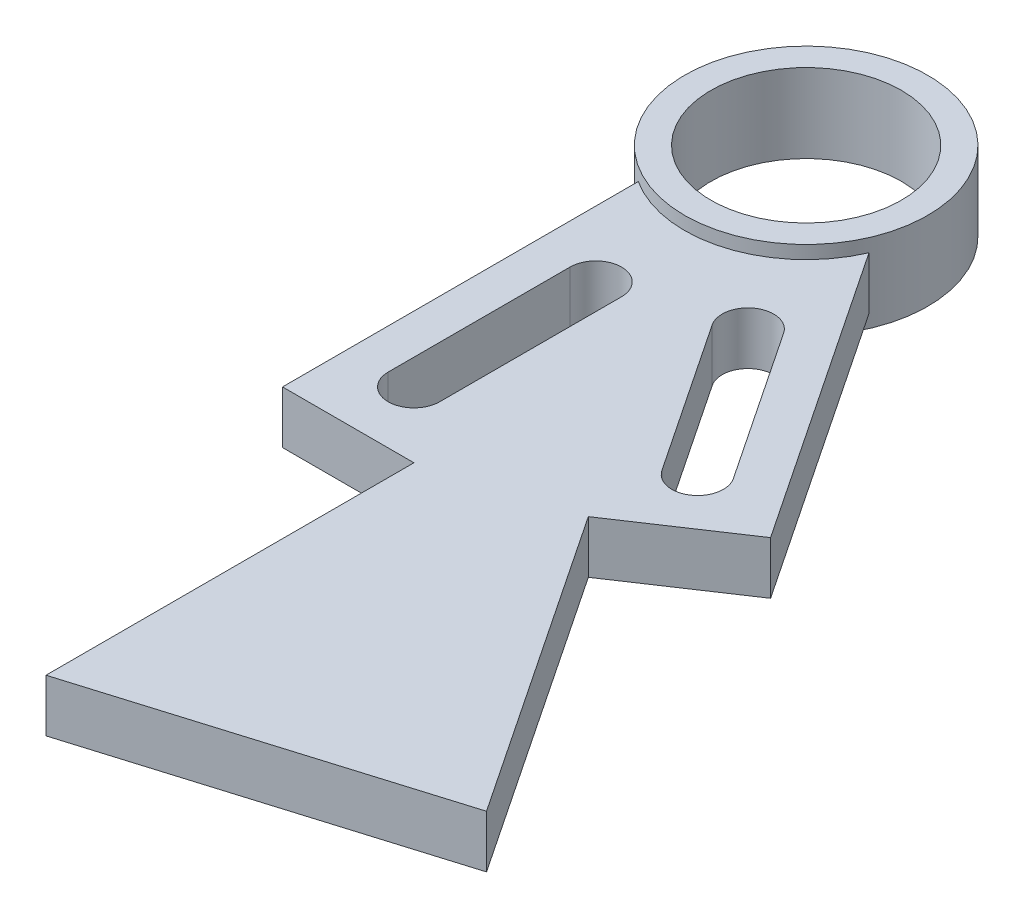
ISO-10303-21;
HEADER;
FILE_DESCRIPTION(('STEP AP214'),'2;1');
FILE_NAME('part.step','',(''),(''),'','','');
FILE_SCHEMA(('AUTOMOTIVE_DESIGN { 1 0 10303 214 1 1 1 1 }'));
ENDSEC;
DATA;
#1=APPLICATION_CONTEXT('core data for automotive mechanical design processes');
#2=APPLICATION_PROTOCOL_DEFINITION('international standard','automotive_design',2000,#1);
#3=PRODUCT_CONTEXT('',#1,'mechanical');
#4=PRODUCT('Part','Part','',(#3));
#5=PRODUCT_RELATED_PRODUCT_CATEGORY('part','',(#4));
#6=PRODUCT_DEFINITION_FORMATION('','',#4);
#7=PRODUCT_DEFINITION_CONTEXT('part definition',#1,'design');
#8=PRODUCT_DEFINITION('design','',#6,#7);
#9=PRODUCT_DEFINITION_SHAPE('','',#8);
#10=(LENGTH_UNIT() NAMED_UNIT(*) SI_UNIT(.MILLI.,.METRE.));
#11=(NAMED_UNIT(*) PLANE_ANGLE_UNIT() SI_UNIT($,.RADIAN.));
#12=(NAMED_UNIT(*) SI_UNIT($,.STERADIAN.) SOLID_ANGLE_UNIT());
#13=UNCERTAINTY_MEASURE_WITH_UNIT(LENGTH_MEASURE(1.E-05),#10,'distance_accuracy_value','');
#14=(GEOMETRIC_REPRESENTATION_CONTEXT(3) GLOBAL_UNCERTAINTY_ASSIGNED_CONTEXT((#13)) GLOBAL_UNIT_ASSIGNED_CONTEXT((#10,
#11,#12)) REPRESENTATION_CONTEXT('',''));
#15=CARTESIAN_POINT('',(0.,0.,0.));
#16=DIRECTION('',(0.,0.,1.));
#17=DIRECTION('',(1.,0.,0.));
#18=AXIS2_PLACEMENT_3D('',#15,#16,#17);
#19=CARTESIAN_POINT('',(0.,4.7625,0.));
#20=DIRECTION('',(0.,-1.,0.));
#21=DIRECTION('',(0.,0.,-1.));
#22=AXIS2_PLACEMENT_3D('',#19,#20,#21);
#23=CYLINDRICAL_SURFACE('',#22,11.5062);
#24=CARTESIAN_POINT('',(0.,4.7625,0.));
#25=DIRECTION('',(0.,1.,0.));
#26=DIRECTION('',(0.,0.,1.));
#27=AXIS2_PLACEMENT_3D('',#24,#25,#26);
#28=CIRCLE('',#27,11.5062);
#29=CARTESIAN_POINT('',(0.,4.7625,-11.5062));
#30=VERTEX_POINT('',#29);
#31=EDGE_CURVE('E51',#30,#30,#28,.T.);
#32=CARTESIAN_POINT('',(0.,-4.7625,0.));
#33=DIRECTION('',(0.,1.,0.));
#34=DIRECTION('',(0.,0.,1.));
#35=AXIS2_PLACEMENT_3D('',#32,#33,#34);
#36=CIRCLE('',#35,11.5062);
#37=CARTESIAN_POINT('',(0.,-4.7625,-11.5062));
#38=VERTEX_POINT('',#37);
#39=EDGE_CURVE('E271',#38,#38,#36,.T.);
#40=CARTESIAN_POINT('',(0.,4.7625,-11.5062));
#41=CARTESIAN_POINT('',(0.,4.66328125,-11.5062));
#42=CARTESIAN_POINT('',(0.,4.5640625,-11.5062));
#43=CARTESIAN_POINT('',(0.,4.365625,-11.5062));
#44=CARTESIAN_POINT('',(0.,4.26640625,-11.5062));
#45=CARTESIAN_POINT('',(0.,4.06796875,-11.5062));
#46=CARTESIAN_POINT('',(0.,3.96875,-11.5062));
#47=CARTESIAN_POINT('',(0.,3.7703125,-11.5062));
#48=CARTESIAN_POINT('',(0.,3.67109375,-11.5062));
#49=CARTESIAN_POINT('',(0.,3.47265625,-11.5062));
#50=CARTESIAN_POINT('',(0.,3.3734375,-11.5062));
#51=CARTESIAN_POINT('',(0.,3.175,-11.5062));
#52=CARTESIAN_POINT('',(0.,3.07578125,-11.5062));
#53=CARTESIAN_POINT('',(0.,2.87734375,-11.5062));
#54=CARTESIAN_POINT('',(0.,2.778125,-11.5062));
#55=CARTESIAN_POINT('',(0.,2.5796875,-11.5062));
#56=CARTESIAN_POINT('',(0.,2.48046875,-11.5062));
#57=CARTESIAN_POINT('',(0.,2.28203125,-11.5062));
#58=CARTESIAN_POINT('',(0.,2.1828125,-11.5062));
#59=CARTESIAN_POINT('',(0.,1.984375,-11.5062));
#60=CARTESIAN_POINT('',(0.,1.88515625,-11.5062));
#61=CARTESIAN_POINT('',(0.,1.68671875,-11.5062));
#62=CARTESIAN_POINT('',(0.,1.5875,-11.5062));
#63=CARTESIAN_POINT('',(0.,1.3890625,-11.5062));
#64=CARTESIAN_POINT('',(0.,1.28984375,-11.5062));
#65=CARTESIAN_POINT('',(0.,1.09140625,-11.5062));
#66=CARTESIAN_POINT('',(0.,0.992187499999999,-11.5062));
#67=CARTESIAN_POINT('',(0.,0.79375,-11.5062));
#68=CARTESIAN_POINT('',(0.,0.69453125,-11.5062));
#69=CARTESIAN_POINT('',(0.,0.49609375,-11.5062));
#70=CARTESIAN_POINT('',(0.,0.396875,-11.5062));
#71=CARTESIAN_POINT('',(0.,0.1984375,-11.5062));
#72=CARTESIAN_POINT('',(0.,0.0992187500000001,-11.5062));
#73=CARTESIAN_POINT('',(0.,-0.0992187500000001,-11.5062));
#74=CARTESIAN_POINT('',(0.,-0.1984375,-11.5062));
#75=CARTESIAN_POINT('',(0.,-0.396875,-11.5062));
#76=CARTESIAN_POINT('',(0.,-0.49609375,-11.5062));
#77=CARTESIAN_POINT('',(0.,-0.69453125,-11.5062));
#78=CARTESIAN_POINT('',(0.,-0.793750000000001,-11.5062));
#79=CARTESIAN_POINT('',(0.,-0.992187500000001,-11.5062));
#80=CARTESIAN_POINT('',(0.,-1.09140625,-11.5062));
#81=CARTESIAN_POINT('',(0.,-1.28984375,-11.5062));
#82=CARTESIAN_POINT('',(0.,-1.3890625,-11.5062));
#83=CARTESIAN_POINT('',(0.,-1.5875,-11.5062));
#84=CARTESIAN_POINT('',(0.,-1.68671875,-11.5062));
#85=CARTESIAN_POINT('',(0.,-1.88515625,-11.5062));
#86=CARTESIAN_POINT('',(0.,-1.984375,-11.5062));
#87=CARTESIAN_POINT('',(0.,-2.1828125,-11.5062));
#88=CARTESIAN_POINT('',(0.,-2.28203125,-11.5062));
#89=CARTESIAN_POINT('',(0.,-2.48046875,-11.5062));
#90=CARTESIAN_POINT('',(0.,-2.5796875,-11.5062));
#91=CARTESIAN_POINT('',(0.,-2.778125,-11.5062));
#92=CARTESIAN_POINT('',(0.,-2.87734375,-11.5062));
#93=CARTESIAN_POINT('',(0.,-3.07578125,-11.5062));
#94=CARTESIAN_POINT('',(0.,-3.175,-11.5062));
#95=CARTESIAN_POINT('',(0.,-3.3734375,-11.5062));
#96=CARTESIAN_POINT('',(0.,-3.47265625,-11.5062));
#97=CARTESIAN_POINT('',(0.,-3.67109375,-11.5062));
#98=CARTESIAN_POINT('',(0.,-3.7703125,-11.5062));
#99=CARTESIAN_POINT('',(0.,-3.96875,-11.5062));
#100=CARTESIAN_POINT('',(0.,-4.06796875,-11.5062));
#101=CARTESIAN_POINT('',(0.,-4.26640625,-11.5062));
#102=CARTESIAN_POINT('',(0.,-4.365625,-11.5062));
#103=CARTESIAN_POINT('',(0.,-4.5640625,-11.5062));
#104=CARTESIAN_POINT('',(0.,-4.66328125,-11.5062));
#105=CARTESIAN_POINT('',(0.,-4.7625,-11.5062));
#106=B_SPLINE_CURVE_WITH_KNOTS('',3,(#40,#41,#42,#43,#44,#45,#46,#47,#48,#49,#50,#51,#52,#53,
#54,#55,#56,#57,#58,#59,#60,#61,#62,#63,#64,#65,#66,#67,#68,#69,#70,#71,#72,#73,#74,#75,#76,#77,
#78,#79,#80,#81,#82,#83,#84,#85,#86,#87,#88,#89,#90,#91,#92,#93,#94,#95,#96,#97,#98,#99,#100,
#101,#102,#103,#104,#105),.UNSPECIFIED.,.F.,.F.,(4,2,2,2,2,2,2,2,2,2,2,2,2,2,2,2,2,2,2,2,2,2,2,
2,2,2,2,2,2,2,2,2,4),(0.,0.29765625,0.5953125,0.892968750000001,1.190625,1.48828125,1.7859375,
2.08359375,2.38125,2.67890625,2.9765625,3.27421875,3.571875,3.86953125,4.1671875,4.46484375,
4.7625,5.06015625,5.3578125,5.65546875,5.953125,6.25078125,6.5484375,6.84609375,7.14375,
7.44140625,7.7390625,8.03671875,8.334375,8.63203125,8.9296875,9.22734375,9.525),.UNSPECIFIED.);
#107=EDGE_CURVE('BSEAM43',#30,#38,#106,.T.);
#108=ORIENTED_EDGE('',*,*,#31,.T.);
#109=ORIENTED_EDGE('',*,*,#39,.F.);
#110=ORIENTED_EDGE('',*,*,#107,.T.);
#111=ORIENTED_EDGE('',*,*,#107,.F.);
#112=EDGE_LOOP('',(#108,#110,#109,#111));
#113=FACE_BOUND('',#112,.T.);
#114=ADVANCED_FACE('F43',(#113),#23,.F.);
#115=CARTESIAN_POINT('',(0.,4.7625,0.));
#116=DIRECTION('',(0.,-1.,0.));
#117=DIRECTION('',(0.,0.,-1.));
#118=AXIS2_PLACEMENT_3D('',#115,#116,#117);
#119=CYLINDRICAL_SURFACE('',#118,14.6812);
#120=DIRECTION('',(0.,-1.,0.));
#121=VECTOR('',#120,1.);
#122=CARTESIAN_POINT('',(-7.93749999999998,3.175,12.3504545337409));
#123=LINE('',#122,#121);
#124=CARTESIAN_POINT('',(-7.93749999999998,3.175,12.3504545337409));
#125=VERTEX_POINT('',#124);
#126=CARTESIAN_POINT('',(-7.93749999999998,-3.175,12.3504545337409));
#127=VERTEX_POINT('',#126);
#128=EDGE_CURVE('E64',#125,#127,#123,.T.);
#129=ORIENTED_EDGE('',*,*,#128,.F.);
#130=CARTESIAN_POINT('',(0.,3.175,0.));
#131=DIRECTION('',(0.,1.,0.));
#132=DIRECTION('',(0.,0.,1.));
#133=AXIS2_PLACEMENT_3D('',#130,#131,#132);
#134=CIRCLE('',#133,14.6812);
#135=CARTESIAN_POINT('',(13.4579373358023,3.175,5.86698867440691));
#136=VERTEX_POINT('',#135);
#137=EDGE_CURVE('E59',#125,#136,#134,.T.);
#138=ORIENTED_EDGE('',*,*,#137,.T.);
#139=DIRECTION('',(0.,-1.,0.));
#140=VECTOR('',#139,1.);
#141=CARTESIAN_POINT('',(13.4579373358023,3.175,5.86698867440691));
#142=LINE('',#141,#140);
#143=CARTESIAN_POINT('',(13.4579373358023,-3.175,5.86698867440691));
#144=VERTEX_POINT('',#143);
#145=EDGE_CURVE('E282',#136,#144,#142,.T.);
#146=ORIENTED_EDGE('',*,*,#145,.T.);
#147=CARTESIAN_POINT('',(0.,-3.175,0.));
#148=DIRECTION('',(0.,1.,0.));
#149=DIRECTION('',(0.,0.,1.));
#150=AXIS2_PLACEMENT_3D('',#147,#148,#149);
#151=CIRCLE('',#150,14.6812);
#152=EDGE_CURVE('E236',#127,#144,#151,.T.);
#153=ORIENTED_EDGE('',*,*,#152,.F.);
#154=EDGE_LOOP('',(#129,#138,#146,#153));
#155=FACE_BOUND('',#154,.T.);
#156=CARTESIAN_POINT('',(0.,4.7625,0.));
#157=DIRECTION('',(0.,1.,0.));
#158=DIRECTION('',(0.,0.,1.));
#159=AXIS2_PLACEMENT_3D('',#156,#157,#158);
#160=CIRCLE('',#159,14.6812);
#161=CARTESIAN_POINT('',(0.,4.7625,14.6812));
#162=VERTEX_POINT('',#161);
#163=EDGE_CURVE('E11',#162,#162,#160,.T.);
#164=ORIENTED_EDGE('',*,*,#163,.F.);
#165=EDGE_LOOP('',(#164));
#166=FACE_BOUND('',#165,.T.);
#167=CARTESIAN_POINT('',(0.,-4.7625,0.));
#168=DIRECTION('',(0.,1.,0.));
#169=DIRECTION('',(0.,0.,1.));
#170=AXIS2_PLACEMENT_3D('',#167,#168,#169);
#171=CIRCLE('',#170,14.6812);
#172=CARTESIAN_POINT('',(0.,-4.7625,14.6812));
#173=VERTEX_POINT('',#172);
#174=EDGE_CURVE('E46',#173,#173,#171,.T.);
#175=ORIENTED_EDGE('',*,*,#174,.T.);
#176=EDGE_LOOP('',(#175));
#177=FACE_BOUND('',#176,.T.);
#178=ADVANCED_FACE('F299',(#155,#166,#177),#119,.T.);
#179=CARTESIAN_POINT('',(0.,4.7625,0.));
#180=DIRECTION('',(0.,1.,0.));
#181=DIRECTION('',(0.,0.,1.));
#182=AXIS2_PLACEMENT_3D('',#179,#180,#181);
#183=PLANE('',#182);
#184=ORIENTED_EDGE('',*,*,#31,.F.);
#185=EDGE_LOOP('',(#184));
#186=FACE_BOUND('',#185,.T.);
#187=ORIENTED_EDGE('',*,*,#163,.T.);
#188=EDGE_LOOP('',(#187));
#189=FACE_BOUND('',#188,.T.);
#190=ADVANCED_FACE('F304',(#186,#189),#183,.T.);
#191=CARTESIAN_POINT('',(0.,-4.7625,0.));
#192=DIRECTION('',(0.,1.,0.));
#193=DIRECTION('',(0.,0.,1.));
#194=AXIS2_PLACEMENT_3D('',#191,#192,#193);
#195=PLANE('',#194);
#196=ORIENTED_EDGE('',*,*,#39,.T.);
#197=EDGE_LOOP('',(#196));
#198=FACE_BOUND('',#197,.T.);
#199=ORIENTED_EDGE('',*,*,#174,.F.);
#200=EDGE_LOOP('',(#199));
#201=FACE_BOUND('',#200,.T.);
#202=ADVANCED_FACE('F301',(#198,#201),#195,.F.);
#203=CARTESIAN_POINT('',(0.,3.175,25.4127));
#204=DIRECTION('',(0.,-1.,0.));
#205=DIRECTION('',(0.,0.,-1.));
#206=AXIS2_PLACEMENT_3D('',#203,#204,#205);
#207=CYLINDRICAL_SURFACE('',#206,3.1115);
#208=CARTESIAN_POINT('',(0.,-3.175,25.4127));
#209=DIRECTION('',(0.,1.,0.));
#210=DIRECTION('',(0.,0.,1.));
#211=AXIS2_PLACEMENT_3D('',#208,#209,#210);
#212=CIRCLE('',#211,3.1115);
#213=CARTESIAN_POINT('',(3.1115,-3.175,25.4127));
#214=VERTEX_POINT('',#213);
#215=CARTESIAN_POINT('',(-3.11150000000001,-3.175,25.4127));
#216=VERTEX_POINT('',#215);
#217=EDGE_CURVE('E251',#214,#216,#212,.T.);
#218=ORIENTED_EDGE('',*,*,#217,.F.);
#219=DIRECTION('',(0.,-1.,0.));
#220=VECTOR('',#219,1.);
#221=CARTESIAN_POINT('',(3.1115,3.175,25.4127));
#222=LINE('',#221,#220);
#223=CARTESIAN_POINT('',(3.1115,3.175,25.4127));
#224=VERTEX_POINT('',#223);
#225=EDGE_CURVE('E269',#224,#214,#222,.T.);
#226=ORIENTED_EDGE('',*,*,#225,.F.);
#227=CARTESIAN_POINT('',(0.,3.175,25.4127));
#228=DIRECTION('',(0.,1.,0.));
#229=DIRECTION('',(0.,0.,1.));
#230=AXIS2_PLACEMENT_3D('',#227,#228,#229);
#231=CIRCLE('',#230,3.1115);
#232=CARTESIAN_POINT('',(-3.11150000000001,3.175,25.4127));
#233=VERTEX_POINT('',#232);
#234=EDGE_CURVE('E206',#224,#233,#231,.T.);
#235=ORIENTED_EDGE('',*,*,#234,.T.);
#236=DIRECTION('',(0.,-1.,0.));
#237=VECTOR('',#236,1.);
#238=CARTESIAN_POINT('',(-3.11150000000001,3.175,25.4127));
#239=LINE('',#238,#237);
#240=EDGE_CURVE('E262',#233,#216,#239,.T.);
#241=ORIENTED_EDGE('',*,*,#240,.T.);
#242=EDGE_LOOP('',(#218,#226,#235,#241));
#243=FACE_BOUND('',#242,.T.);
#244=ADVANCED_FACE('F303',(#243),#207,.F.);
#245=CARTESIAN_POINT('',(3.11149999999999,3.175,0.));
#246=DIRECTION('',(-1.,0.,0.));
#247=DIRECTION('',(0.,0.,1.));
#248=AXIS2_PLACEMENT_3D('',#245,#246,#247);
#249=PLANE('',#248);
#250=DIRECTION('',(0.,0.,-1.));
#251=VECTOR('',#250,1.);
#252=CARTESIAN_POINT('',(3.11149999999999,-3.175,0.));
#253=LINE('',#252,#251);
#254=CARTESIAN_POINT('',(3.1115,-3.175,47.3837));
#255=VERTEX_POINT('',#254);
#256=EDGE_CURVE('E254',#255,#214,#253,.T.);
#257=ORIENTED_EDGE('',*,*,#256,.F.);
#258=DIRECTION('',(0.,-1.,0.));
#259=VECTOR('',#258,1.);
#260=CARTESIAN_POINT('',(3.1115,3.175,47.3837));
#261=LINE('',#260,#259);
#262=CARTESIAN_POINT('',(3.1115,3.175,47.3837));
#263=VERTEX_POINT('',#262);
#264=EDGE_CURVE('E267',#263,#255,#261,.T.);
#265=ORIENTED_EDGE('',*,*,#264,.F.);
#266=DIRECTION('',(0.,0.,-1.));
#267=VECTOR('',#266,1.);
#268=CARTESIAN_POINT('',(3.11149999999999,3.175,0.));
#269=LINE('',#268,#267);
#270=EDGE_CURVE('E209',#263,#224,#269,.T.);
#271=ORIENTED_EDGE('',*,*,#270,.T.);
#272=ORIENTED_EDGE('',*,*,#225,.T.);
#273=EDGE_LOOP('',(#257,#265,#271,#272));
#274=FACE_BOUND('',#273,.T.);
#275=ADVANCED_FACE('F311',(#274),#249,.T.);
#276=CARTESIAN_POINT('',(0.,3.175,47.3837));
#277=DIRECTION('',(0.,-1.,0.));
#278=DIRECTION('',(0.,0.,-1.));
#279=AXIS2_PLACEMENT_3D('',#276,#277,#278);
#280=CYLINDRICAL_SURFACE('',#279,3.1115);
#281=CARTESIAN_POINT('',(0.,-3.175,47.3837));
#282=DIRECTION('',(0.,1.,0.));
#283=DIRECTION('',(0.,0.,1.));
#284=AXIS2_PLACEMENT_3D('',#281,#282,#283);
#285=CIRCLE('',#284,3.1115);
#286=CARTESIAN_POINT('',(-3.1115,-3.175,47.3837));
#287=VERTEX_POINT('',#286);
#288=EDGE_CURVE('E257',#287,#255,#285,.T.);
#289=ORIENTED_EDGE('',*,*,#288,.F.);
#290=DIRECTION('',(0.,-1.,0.));
#291=VECTOR('',#290,1.);
#292=CARTESIAN_POINT('',(-3.1115,3.175,47.3837));
#293=LINE('',#292,#291);
#294=CARTESIAN_POINT('',(-3.1115,3.175,47.3837));
#295=VERTEX_POINT('',#294);
#296=EDGE_CURVE('E264',#295,#287,#293,.T.);
#297=ORIENTED_EDGE('',*,*,#296,.F.);
#298=CARTESIAN_POINT('',(0.,3.175,47.3837));
#299=DIRECTION('',(0.,1.,0.));
#300=DIRECTION('',(0.,0.,1.));
#301=AXIS2_PLACEMENT_3D('',#298,#299,#300);
#302=CIRCLE('',#301,3.1115);
#303=EDGE_CURVE('E212',#295,#263,#302,.T.);
#304=ORIENTED_EDGE('',*,*,#303,.T.);
#305=ORIENTED_EDGE('',*,*,#264,.T.);
#306=EDGE_LOOP('',(#289,#297,#304,#305));
#307=FACE_BOUND('',#306,.T.);
#308=ADVANCED_FACE('F340',(#307),#280,.F.);
#309=CARTESIAN_POINT('',(-6.60234440706483,3.175,4.40601345668633));
#310=DIRECTION('',(0.831791421362489,0.,-0.555088309503785));
#311=DIRECTION('',(-0.555088309503785,0.,-0.83179142136249));
#312=AXIS2_PLACEMENT_3D('',#309,#310,#311);
#313=PLANE('',#312);
#314=DIRECTION('',(0.555088309503785,0.,0.831791421362489));
#315=VECTOR('',#314,1.);
#316=CARTESIAN_POINT('',(-6.60234440706483,-3.175,4.40601345668633));
#317=LINE('',#316,#315);
#318=CARTESIAN_POINT('',(24.1058069806559,-3.175,50.4217130361649));
#319=VERTEX_POINT('',#318);
#320=CARTESIAN_POINT('',(48.7794823380992,-3.175,87.3948417157275));
#321=VERTEX_POINT('',#320);
#322=EDGE_CURVE('E227',#319,#321,#317,.T.);
#323=ORIENTED_EDGE('',*,*,#322,.F.);
#324=DIRECTION('',(0.,-1.,0.));
#325=VECTOR('',#324,1.);
#326=CARTESIAN_POINT('',(24.1058069806559,3.175,50.4217130361649));
#327=LINE('',#326,#325);
#328=CARTESIAN_POINT('',(24.1058069806559,3.175,50.4217130361649));
#329=VERTEX_POINT('',#328);
#330=EDGE_CURVE('E265',#329,#319,#327,.T.);
#331=ORIENTED_EDGE('',*,*,#330,.F.);
#332=DIRECTION('',(0.555088309503785,0.,0.831791421362489));
#333=VECTOR('',#332,1.);
#334=CARTESIAN_POINT('',(-6.60234440706483,3.175,4.40601345668633));
#335=LINE('',#334,#333);
#336=CARTESIAN_POINT('',(48.7794823380992,3.175,87.3948417157275));
#337=VERTEX_POINT('',#336);
#338=EDGE_CURVE('E186',#329,#337,#335,.T.);
#339=ORIENTED_EDGE('',*,*,#338,.T.);
#340=DIRECTION('',(0.,-1.,0.));
#341=VECTOR('',#340,1.);
#342=CARTESIAN_POINT('',(48.7794823380992,3.175,87.3948417157275));
#343=LINE('',#342,#341);
#344=EDGE_CURVE('E165',#337,#321,#343,.T.);
#345=ORIENTED_EDGE('',*,*,#344,.T.);
#346=EDGE_LOOP('',(#323,#331,#339,#345));
#347=FACE_BOUND('',#346,.T.);
#348=ADVANCED_FACE('F349',(#347),#313,.T.);
#349=CARTESIAN_POINT('',(30.7081513877208,3.175,46.0156995794786));
#350=DIRECTION('',(-0.555088309503784,0.,-0.83179142136249));
#351=DIRECTION('',(-0.83179142136249,0.,0.555088309503784));
#352=AXIS2_PLACEMENT_3D('',#349,#350,#351);
#353=PLANE('',#352);
#354=DIRECTION('',(0.83179142136249,0.,-0.555088309503784));
#355=VECTOR('',#354,1.);
#356=CARTESIAN_POINT('',(30.7081513877208,-3.175,46.0156995794786));
#357=LINE('',#356,#355);
#358=CARTESIAN_POINT('',(37.3104957947855,-3.175,41.6096861227923));
#359=VERTEX_POINT('',#358);
#360=EDGE_CURVE('E230',#319,#359,#357,.T.);
#361=ORIENTED_EDGE('',*,*,#360,.T.);
#362=DIRECTION('',(0.,-1.,0.));
#363=VECTOR('',#362,1.);
#364=CARTESIAN_POINT('',(37.3104957947855,3.175,41.6096861227923));
#365=LINE('',#364,#363);
#366=CARTESIAN_POINT('',(37.3104957947855,3.175,41.6096861227923));
#367=VERTEX_POINT('',#366);
#368=EDGE_CURVE('E284',#367,#359,#365,.T.);
#369=ORIENTED_EDGE('',*,*,#368,.F.);
#370=DIRECTION('',(0.83179142136249,0.,-0.555088309503784));
#371=VECTOR('',#370,1.);
#372=CARTESIAN_POINT('',(30.7081513877208,3.175,46.0156995794786));
#373=LINE('',#372,#371);
#374=EDGE_CURVE('E189',#329,#367,#373,.T.);
#375=ORIENTED_EDGE('',*,*,#374,.F.);
#376=ORIENTED_EDGE('',*,*,#330,.T.);
#377=EDGE_LOOP('',(#361,#369,#375,#376));
#378=FACE_BOUND('',#377,.T.);
#379=ADVANCED_FACE('F358',(#378),#353,.F.);
#380=CARTESIAN_POINT('',(6.60234440706468,3.175,-4.40601345668624));
#381=DIRECTION('',(-0.831791421362489,0.,0.555088309503785));
#382=DIRECTION('',(0.555088309503785,0.,0.831791421362489));
#383=AXIS2_PLACEMENT_3D('',#380,#381,#382);
#384=PLANE('',#383);
#385=DIRECTION('',(-0.555088309503785,0.,-0.831791421362489));
#386=VECTOR('',#385,1.);
#387=CARTESIAN_POINT('',(6.60234440706468,-3.175,-4.40601345668624));
#388=LINE('',#387,#386);
#389=EDGE_CURVE('E233',#359,#144,#388,.T.);
#390=ORIENTED_EDGE('',*,*,#389,.T.);
#391=ORIENTED_EDGE('',*,*,#145,.F.);
#392=DIRECTION('',(-0.555088309503785,0.,-0.831791421362489));
#393=VECTOR('',#392,1.);
#394=CARTESIAN_POINT('',(6.60234440706468,3.175,-4.40601345668624));
#395=LINE('',#394,#393);
#396=EDGE_CURVE('E192',#367,#136,#395,.T.);
#397=ORIENTED_EDGE('',*,*,#396,.F.);
#398=ORIENTED_EDGE('',*,*,#368,.T.);
#399=EDGE_LOOP('',(#390,#391,#397,#398));
#400=FACE_BOUND('',#399,.T.);
#401=ADVANCED_FACE('F367',(#400),#384,.F.);
#402=CARTESIAN_POINT('',(-7.93749999999998,3.175,0.));
#403=DIRECTION('',(-1.,0.,0.));
#404=DIRECTION('',(0.,0.,1.));
#405=AXIS2_PLACEMENT_3D('',#402,#403,#404);
#406=PLANE('',#405);
#407=DIRECTION('',(0.,0.,-1.));
#408=VECTOR('',#407,1.);
#409=CARTESIAN_POINT('',(-7.93749999999998,-3.175,0.));
#410=LINE('',#409,#408);
#411=CARTESIAN_POINT('',(-7.93749999999998,-3.175,55.3212));
#412=VERTEX_POINT('',#411);
#413=EDGE_CURVE('E239',#412,#127,#410,.T.);
#414=ORIENTED_EDGE('',*,*,#413,.F.);
#415=DIRECTION('',(0.,-1.,0.));
#416=VECTOR('',#415,1.);
#417=CARTESIAN_POINT('',(-7.93749999999998,3.175,55.3212));
#418=LINE('',#417,#416);
#419=CARTESIAN_POINT('',(-7.93749999999998,3.175,55.3212));
#420=VERTEX_POINT('',#419);
#421=EDGE_CURVE('E279',#420,#412,#418,.T.);
#422=ORIENTED_EDGE('',*,*,#421,.F.);
#423=DIRECTION('',(0.,0.,-1.));
#424=VECTOR('',#423,1.);
#425=CARTESIAN_POINT('',(-7.93749999999998,3.175,0.));
#426=LINE('',#425,#424);
#427=EDGE_CURVE('E195',#420,#125,#426,.T.);
#428=ORIENTED_EDGE('',*,*,#427,.T.);
#429=ORIENTED_EDGE('',*,*,#128,.T.);
#430=EDGE_LOOP('',(#414,#422,#428,#429));
#431=FACE_BOUND('',#430,.T.);
#432=ADVANCED_FACE('F376',(#431),#406,.T.);
#433=CARTESIAN_POINT('',(0.,3.175,55.3212));
#434=DIRECTION('',(0.,0.,-1.));
#435=DIRECTION('',(-1.,0.,0.));
#436=AXIS2_PLACEMENT_3D('',#433,#434,#435);
#437=PLANE('',#436);
#438=DIRECTION('',(1.,0.,0.));
#439=VECTOR('',#438,1.);
#440=CARTESIAN_POINT('',(0.,-3.175,55.3212));
#441=LINE('',#440,#439);
#442=CARTESIAN_POINT('',(7.93750000000002,-3.175,55.3212));
#443=VERTEX_POINT('',#442);
#444=EDGE_CURVE('E242',#412,#443,#441,.T.);
#445=ORIENTED_EDGE('',*,*,#444,.T.);
#446=DIRECTION('',(0.,-1.,0.));
#447=VECTOR('',#446,1.);
#448=CARTESIAN_POINT('',(7.93750000000002,3.175,55.3212));
#449=LINE('',#448,#447);
#450=CARTESIAN_POINT('',(7.93750000000002,3.175,55.3212));
#451=VERTEX_POINT('',#450);
#452=EDGE_CURVE('E276',#451,#443,#449,.T.);
#453=ORIENTED_EDGE('',*,*,#452,.F.);
#454=DIRECTION('',(1.,0.,0.));
#455=VECTOR('',#454,1.);
#456=CARTESIAN_POINT('',(0.,3.175,55.3212));
#457=LINE('',#456,#455);
#458=EDGE_CURVE('E198',#420,#451,#457,.T.);
#459=ORIENTED_EDGE('',*,*,#458,.F.);
#460=ORIENTED_EDGE('',*,*,#421,.T.);
#461=EDGE_LOOP('',(#445,#453,#459,#460));
#462=FACE_BOUND('',#461,.T.);
#463=ADVANCED_FACE('F385',(#462),#437,.F.);
#464=CARTESIAN_POINT('',(7.93750000000005,3.175,0.));
#465=DIRECTION('',(1.,0.,0.));
#466=DIRECTION('',(0.,0.,-1.));
#467=AXIS2_PLACEMENT_3D('',#464,#465,#466);
#468=PLANE('',#467);
#469=DIRECTION('',(0.,0.,1.));
#470=VECTOR('',#469,1.);
#471=CARTESIAN_POINT('',(7.93750000000005,-3.175,0.));
#472=LINE('',#471,#470);
#473=CARTESIAN_POINT('',(7.9375,-3.175,99.7712));
#474=VERTEX_POINT('',#473);
#475=EDGE_CURVE('E245',#443,#474,#472,.T.);
#476=ORIENTED_EDGE('',*,*,#475,.T.);
#477=DIRECTION('',(0.,-1.,0.));
#478=VECTOR('',#477,1.);
#479=CARTESIAN_POINT('',(7.9375,3.175,99.7712));
#480=LINE('',#479,#478);
#481=CARTESIAN_POINT('',(7.9375,3.175,99.7712));
#482=VERTEX_POINT('',#481);
#483=EDGE_CURVE('E273',#482,#474,#480,.T.);
#484=ORIENTED_EDGE('',*,*,#483,.F.);
#485=DIRECTION('',(0.,0.,1.));
#486=VECTOR('',#485,1.);
#487=CARTESIAN_POINT('',(7.93750000000005,3.175,0.));
#488=LINE('',#487,#486);
#489=EDGE_CURVE('E201',#451,#482,#488,.T.);
#490=ORIENTED_EDGE('',*,*,#489,.F.);
#491=ORIENTED_EDGE('',*,*,#452,.T.);
#492=EDGE_LOOP('',(#476,#484,#490,#491));
#493=FACE_BOUND('',#492,.T.);
#494=ADVANCED_FACE('F394',(#493),#468,.F.);
#495=CARTESIAN_POINT('',(26.3021379310344,3.175,39.4133551724139));
#496=DIRECTION('',(0.,-1.,0.));
#497=DIRECTION('',(0.,0.,-1.));
#498=AXIS2_PLACEMENT_3D('',#495,#496,#497);
#499=CYLINDRICAL_SURFACE('',#498,3.11150000000001);
#500=CARTESIAN_POINT('',(26.3021379310344,-3.175,39.4133551724139));
#501=DIRECTION('',(0.,1.,0.));
#502=DIRECTION('',(0.,0.,1.));
#503=AXIS2_PLACEMENT_3D('',#500,#501,#502);
#504=CIRCLE('',#503,3.11150000000001);
#505=CARTESIAN_POINT('',(23.714018923465,-3.175,41.1405124474349));
#506=VERTEX_POINT('',#505);
#507=CARTESIAN_POINT('',(28.8902569386038,-3.175,37.6861978973928));
#508=VERTEX_POINT('',#507);
#509=EDGE_CURVE('E160',#506,#508,#504,.T.);
#510=ORIENTED_EDGE('',*,*,#509,.F.);
#511=DIRECTION('',(0.,-1.,0.));
#512=VECTOR('',#511,1.);
#513=CARTESIAN_POINT('',(23.714018923465,3.175,41.1405124474349));
#514=LINE('',#513,#512);
#515=CARTESIAN_POINT('',(23.714018923465,3.175,41.1405124474349));
#516=VERTEX_POINT('',#515);
#517=EDGE_CURVE('E155',#516,#506,#514,.T.);
#518=ORIENTED_EDGE('',*,*,#517,.F.);
#519=CARTESIAN_POINT('',(26.3021379310344,3.175,39.4133551724139));
#520=DIRECTION('',(0.,1.,0.));
#521=DIRECTION('',(0.,0.,1.));
#522=AXIS2_PLACEMENT_3D('',#519,#520,#521);
#523=CIRCLE('',#522,3.11150000000001);
#524=CARTESIAN_POINT('',(28.8902569386038,3.175,37.6861978973928));
#525=VERTEX_POINT('',#524);
#526=EDGE_CURVE('E158',#516,#525,#523,.T.);
#527=ORIENTED_EDGE('',*,*,#526,.T.);
#528=DIRECTION('',(0.,-1.,0.));
#529=VECTOR('',#528,1.);
#530=CARTESIAN_POINT('',(28.8902569386038,3.175,37.6861978973928));
#531=LINE('',#530,#529);
#532=EDGE_CURVE('E217',#525,#508,#531,.T.);
#533=ORIENTED_EDGE('',*,*,#532,.T.);
#534=EDGE_LOOP('',(#510,#518,#527,#533));
#535=FACE_BOUND('',#534,.T.);
#536=ADVANCED_FACE('F157',(#535),#499,.F.);
#537=CARTESIAN_POINT('',(-2.58811900756948,3.175,1.72715727502109));
#538=DIRECTION('',(0.83179142136249,0.,-0.555088309503784));
#539=DIRECTION('',(-0.555088309503784,0.,-0.83179142136249));
#540=AXIS2_PLACEMENT_3D('',#537,#538,#539);
#541=PLANE('',#540);
#542=DIRECTION('',(0.555088309503784,0.,0.83179142136249));
#543=VECTOR('',#542,1.);
#544=CARTESIAN_POINT('',(-2.58811900756948,-3.175,1.72715727502109));
#545=LINE('',#544,#543);
#546=CARTESIAN_POINT('',(11.5181736753574,-3.175,22.8652231286796));
#547=VERTEX_POINT('',#546);
#548=EDGE_CURVE('E219',#547,#506,#545,.T.);
#549=ORIENTED_EDGE('',*,*,#548,.F.);
#550=DIRECTION('',(0.,-1.,0.));
#551=VECTOR('',#550,1.);
#552=CARTESIAN_POINT('',(11.5181736753574,3.175,22.8652231286796));
#553=LINE('',#552,#551);
#554=CARTESIAN_POINT('',(11.5181736753574,3.175,22.8652231286796));
#555=VERTEX_POINT('',#554);
#556=EDGE_CURVE('E166',#555,#547,#553,.T.);
#557=ORIENTED_EDGE('',*,*,#556,.F.);
#558=DIRECTION('',(0.555088309503784,0.,0.83179142136249));
#559=VECTOR('',#558,1.);
#560=CARTESIAN_POINT('',(-2.58811900756948,3.175,1.72715727502109));
#561=LINE('',#560,#559);
#562=EDGE_CURVE('E173',#555,#516,#561,.T.);
#563=ORIENTED_EDGE('',*,*,#562,.T.);
#564=ORIENTED_EDGE('',*,*,#517,.T.);
#565=EDGE_LOOP('',(#549,#557,#563,#564));
#566=FACE_BOUND('',#565,.T.);
#567=ADVANCED_FACE('F180',(#566),#541,.T.);
#568=CARTESIAN_POINT('',(14.1062926829267,3.175,21.1380658536586));
#569=DIRECTION('',(0.,-1.,0.));
#570=DIRECTION('',(0.,0.,-1.));
#571=AXIS2_PLACEMENT_3D('',#568,#569,#570);
#572=CYLINDRICAL_SURFACE('',#571,3.1115);
#573=CARTESIAN_POINT('',(14.1062926829267,-3.175,21.1380658536586));
#574=DIRECTION('',(0.,1.,0.));
#575=DIRECTION('',(0.,0.,1.));
#576=AXIS2_PLACEMENT_3D('',#573,#574,#575);
#577=CIRCLE('',#576,3.1115);
#578=CARTESIAN_POINT('',(16.6944116904961,-3.175,19.4109085786376));
#579=VERTEX_POINT('',#578);
#580=EDGE_CURVE('E221',#579,#547,#577,.T.);
#581=ORIENTED_EDGE('',*,*,#580,.F.);
#582=DIRECTION('',(0.,-1.,0.));
#583=VECTOR('',#582,1.);
#584=CARTESIAN_POINT('',(16.6944116904961,3.175,19.4109085786376));
#585=LINE('',#584,#583);
#586=CARTESIAN_POINT('',(16.6944116904961,3.175,19.4109085786376));
#587=VERTEX_POINT('',#586);
#588=EDGE_CURVE('E289',#587,#579,#585,.T.);
#589=ORIENTED_EDGE('',*,*,#588,.F.);
#590=CARTESIAN_POINT('',(14.1062926829267,3.175,21.1380658536586));
#591=DIRECTION('',(0.,1.,0.));
#592=DIRECTION('',(0.,0.,1.));
#593=AXIS2_PLACEMENT_3D('',#590,#591,#592);
#594=CIRCLE('',#593,3.1115);
#595=EDGE_CURVE('E181',#587,#555,#594,.T.);
#596=ORIENTED_EDGE('',*,*,#595,.T.);
#597=ORIENTED_EDGE('',*,*,#556,.T.);
#598=EDGE_LOOP('',(#581,#589,#596,#597));
#599=FACE_BOUND('',#598,.T.);
#600=ADVANCED_FACE('F418',(#599),#572,.F.);
#601=CARTESIAN_POINT('',(28.3584911690496,3.175,93.5830208578638));
#602=DIRECTION('',(-0.29000739528287,0.,-0.957024404433474));
#603=DIRECTION('',(-0.957024404433474,0.,0.29000739528287));
#604=AXIS2_PLACEMENT_3D('',#601,#602,#603);
#605=PLANE('',#604);
#606=DIRECTION('',(0.957024404433474,0.,-0.29000739528287));
#607=VECTOR('',#606,1.);
#608=CARTESIAN_POINT('',(28.3584911690496,-3.175,93.5830208578638));
#609=LINE('',#608,#607);
#610=EDGE_CURVE('E248',#474,#321,#609,.T.);
#611=ORIENTED_EDGE('',*,*,#610,.T.);
#612=ORIENTED_EDGE('',*,*,#344,.F.);
#613=DIRECTION('',(0.957024404433474,0.,-0.29000739528287));
#614=VECTOR('',#613,1.);
#615=CARTESIAN_POINT('',(28.3584911690496,3.175,93.5830208578638));
#616=LINE('',#615,#614);
#617=EDGE_CURVE('E204',#482,#337,#616,.T.);
#618=ORIENTED_EDGE('',*,*,#617,.F.);
#619=ORIENTED_EDGE('',*,*,#483,.T.);
#620=EDGE_LOOP('',(#611,#612,#618,#619));
#621=FACE_BOUND('',#620,.T.);
#622=ADVANCED_FACE('F426',(#621),#605,.F.);
#623=CARTESIAN_POINT('',(2.58811900756928,3.175,-1.72715727502096));
#624=DIRECTION('',(0.831791421362489,0.,-0.555088309503785));
#625=DIRECTION('',(-0.555088309503785,0.,-0.831791421362489));
#626=AXIS2_PLACEMENT_3D('',#623,#624,#625);
#627=PLANE('',#626);
#628=DIRECTION('',(0.555088309503785,0.,0.831791421362489));
#629=VECTOR('',#628,1.);
#630=CARTESIAN_POINT('',(2.58811900756928,-3.175,-1.72715727502096));
#631=LINE('',#630,#629);
#632=EDGE_CURVE('E224',#579,#508,#631,.T.);
#633=ORIENTED_EDGE('',*,*,#632,.T.);
#634=ORIENTED_EDGE('',*,*,#532,.F.);
#635=DIRECTION('',(0.555088309503785,0.,0.831791421362489));
#636=VECTOR('',#635,1.);
#637=CARTESIAN_POINT('',(2.58811900756928,3.175,-1.72715727502096));
#638=LINE('',#637,#636);
#639=EDGE_CURVE('E176',#587,#525,#638,.T.);
#640=ORIENTED_EDGE('',*,*,#639,.F.);
#641=ORIENTED_EDGE('',*,*,#588,.T.);
#642=EDGE_LOOP('',(#633,#634,#640,#641));
#643=FACE_BOUND('',#642,.T.);
#644=ADVANCED_FACE('F435',(#643),#627,.F.);
#645=CARTESIAN_POINT('',(-3.11150000000001,3.175,0.));
#646=DIRECTION('',(-1.,0.,0.));
#647=DIRECTION('',(0.,0.,1.));
#648=AXIS2_PLACEMENT_3D('',#645,#646,#647);
#649=PLANE('',#648);
#650=DIRECTION('',(0.,0.,-1.));
#651=VECTOR('',#650,1.);
#652=CARTESIAN_POINT('',(-3.11150000000001,-3.175,0.));
#653=LINE('',#652,#651);
#654=EDGE_CURVE('E178',#287,#216,#653,.T.);
#655=ORIENTED_EDGE('',*,*,#654,.T.);
#656=ORIENTED_EDGE('',*,*,#240,.F.);
#657=DIRECTION('',(0.,0.,-1.));
#658=VECTOR('',#657,1.);
#659=CARTESIAN_POINT('',(-3.11150000000001,3.175,0.));
#660=LINE('',#659,#658);
#661=EDGE_CURVE('E215',#295,#233,#660,.T.);
#662=ORIENTED_EDGE('',*,*,#661,.F.);
#663=ORIENTED_EDGE('',*,*,#296,.T.);
#664=EDGE_LOOP('',(#655,#656,#662,#663));
#665=FACE_BOUND('',#664,.T.);
#666=ADVANCED_FACE('F444',(#665),#649,.F.);
#667=CARTESIAN_POINT('',(0.,3.175,0.));
#668=DIRECTION('',(0.,1.,0.));
#669=DIRECTION('',(0.,0.,1.));
#670=AXIS2_PLACEMENT_3D('',#667,#668,#669);
#671=PLANE('',#670);
#672=ORIENTED_EDGE('',*,*,#526,.F.);
#673=ORIENTED_EDGE('',*,*,#562,.F.);
#674=ORIENTED_EDGE('',*,*,#595,.F.);
#675=ORIENTED_EDGE('',*,*,#639,.T.);
#676=EDGE_LOOP('',(#672,#673,#674,#675));
#677=FACE_BOUND('',#676,.T.);
#678=ORIENTED_EDGE('',*,*,#338,.F.);
#679=ORIENTED_EDGE('',*,*,#374,.T.);
#680=ORIENTED_EDGE('',*,*,#396,.T.);
#681=ORIENTED_EDGE('',*,*,#137,.F.);
#682=ORIENTED_EDGE('',*,*,#427,.F.);
#683=ORIENTED_EDGE('',*,*,#458,.T.);
#684=ORIENTED_EDGE('',*,*,#489,.T.);
#685=ORIENTED_EDGE('',*,*,#617,.T.);
#686=EDGE_LOOP('',(#678,#679,#680,#681,#682,#683,#684,#685));
#687=FACE_BOUND('',#686,.T.);
#688=ORIENTED_EDGE('',*,*,#234,.F.);
#689=ORIENTED_EDGE('',*,*,#270,.F.);
#690=ORIENTED_EDGE('',*,*,#303,.F.);
#691=ORIENTED_EDGE('',*,*,#661,.T.);
#692=EDGE_LOOP('',(#688,#689,#690,#691));
#693=FACE_BOUND('',#692,.T.);
#694=ADVANCED_FACE('F170',(#677,#687,#693),#671,.T.);
#695=CARTESIAN_POINT('',(0.,-3.175,0.));
#696=DIRECTION('',(0.,1.,0.));
#697=DIRECTION('',(0.,0.,1.));
#698=AXIS2_PLACEMENT_3D('',#695,#696,#697);
#699=PLANE('',#698);
#700=ORIENTED_EDGE('',*,*,#509,.T.);
#701=ORIENTED_EDGE('',*,*,#632,.F.);
#702=ORIENTED_EDGE('',*,*,#580,.T.);
#703=ORIENTED_EDGE('',*,*,#548,.T.);
#704=EDGE_LOOP('',(#700,#701,#702,#703));
#705=FACE_BOUND('',#704,.T.);
#706=ORIENTED_EDGE('',*,*,#322,.T.);
#707=ORIENTED_EDGE('',*,*,#610,.F.);
#708=ORIENTED_EDGE('',*,*,#475,.F.);
#709=ORIENTED_EDGE('',*,*,#444,.F.);
#710=ORIENTED_EDGE('',*,*,#413,.T.);
#711=ORIENTED_EDGE('',*,*,#152,.T.);
#712=ORIENTED_EDGE('',*,*,#389,.F.);
#713=ORIENTED_EDGE('',*,*,#360,.F.);
#714=EDGE_LOOP('',(#706,#707,#708,#709,#710,#711,#712,#713));
#715=FACE_BOUND('',#714,.T.);
#716=ORIENTED_EDGE('',*,*,#217,.T.);
#717=ORIENTED_EDGE('',*,*,#654,.F.);
#718=ORIENTED_EDGE('',*,*,#288,.T.);
#719=ORIENTED_EDGE('',*,*,#256,.T.);
#720=EDGE_LOOP('',(#716,#717,#718,#719));
#721=FACE_BOUND('',#720,.T.);
#722=ADVANCED_FACE('F461',(#705,#715,#721),#699,.F.);
#723=CLOSED_SHELL('',(#114,#178,#190,#202,#244,#275,#308,#348,#379,#401,#432,#463,#494,#536,
#567,#600,#622,#644,#666,#694,#722));
#724=MANIFOLD_SOLID_BREP('B2',#723);
#725=ADVANCED_BREP_SHAPE_REPRESENTATION('',(#18,#724),#14);
#726=SHAPE_DEFINITION_REPRESENTATION(#9,#725);
ENDSEC;
END-ISO-10303-21;
